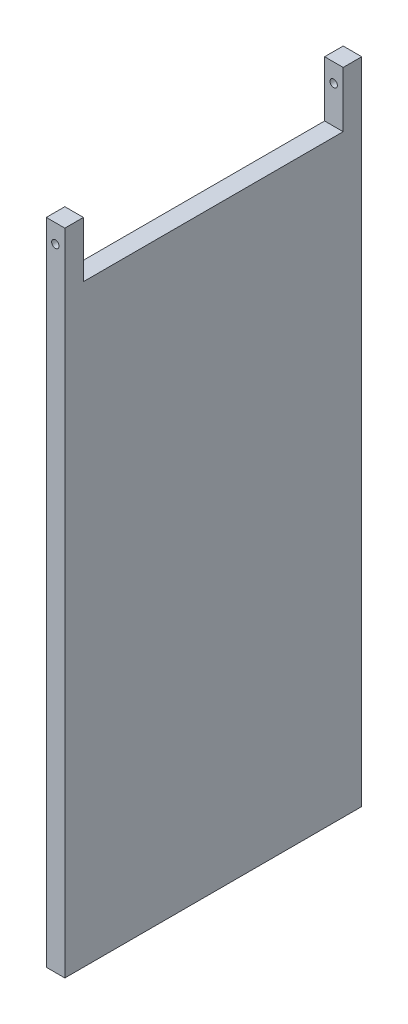
ISO-10303-21;
HEADER;
FILE_DESCRIPTION(('STEP AP214'),'2;1');
FILE_NAME('part.step','',(''),(''),'','','');
FILE_SCHEMA(('AUTOMOTIVE_DESIGN { 1 0 10303 214 1 1 1 1 }'));
ENDSEC;
DATA;
#1=APPLICATION_CONTEXT('core data for automotive mechanical design processes');
#2=APPLICATION_PROTOCOL_DEFINITION('international standard','automotive_design',2000,#1);
#3=PRODUCT_CONTEXT('',#1,'mechanical');
#4=PRODUCT('Part','Part','',(#3));
#5=PRODUCT_RELATED_PRODUCT_CATEGORY('part','',(#4));
#6=PRODUCT_DEFINITION_FORMATION('','',#4);
#7=PRODUCT_DEFINITION_CONTEXT('part definition',#1,'design');
#8=PRODUCT_DEFINITION('design','',#6,#7);
#9=PRODUCT_DEFINITION_SHAPE('','',#8);
#10=(LENGTH_UNIT() NAMED_UNIT(*) SI_UNIT(.MILLI.,.METRE.));
#11=(NAMED_UNIT(*) PLANE_ANGLE_UNIT() SI_UNIT($,.RADIAN.));
#12=(NAMED_UNIT(*) SI_UNIT($,.STERADIAN.) SOLID_ANGLE_UNIT());
#13=UNCERTAINTY_MEASURE_WITH_UNIT(LENGTH_MEASURE(1.E-05),#10,'distance_accuracy_value','');
#14=(GEOMETRIC_REPRESENTATION_CONTEXT(3) GLOBAL_UNCERTAINTY_ASSIGNED_CONTEXT((#13)) GLOBAL_UNIT_ASSIGNED_CONTEXT((#10,
#11,#12)) REPRESENTATION_CONTEXT('',''));
#15=CARTESIAN_POINT('',(0.,0.,0.));
#16=DIRECTION('',(0.,0.,1.));
#17=DIRECTION('',(1.,0.,0.));
#18=AXIS2_PLACEMENT_3D('',#15,#16,#17);
#19=CARTESIAN_POINT('',(-7.4015013693271,128.880516431925,80.));
#20=DIRECTION('',(0.,-1.,0.));
#21=DIRECTION('',(0.,0.,-1.));
#22=AXIS2_PLACEMENT_3D('',#19,#20,#21);
#23=PLANE('',#22);
#24=DIRECTION('',(0.,0.,-1.));
#25=VECTOR('',#24,1.);
#26=CARTESIAN_POINT('',(-2.4015013693271,128.880516431925,80.));
#27=LINE('',#26,#25);
#28=CARTESIAN_POINT('',(-2.4015013693271,128.880516431925,80.));
#29=VERTEX_POINT('',#28);
#30=CARTESIAN_POINT('',(-2.40150136932709,128.880516431925,75.));
#31=VERTEX_POINT('',#30);
#32=EDGE_CURVE('E153',#29,#31,#27,.T.);
#33=ORIENTED_EDGE('',*,*,#32,.T.);
#34=DIRECTION('',(1.,0.,0.));
#35=VECTOR('',#34,1.);
#36=CARTESIAN_POINT('',(-20.,128.880516431925,75.));
#37=LINE('',#36,#35);
#38=CARTESIAN_POINT('',(-7.4015013693271,128.880516431925,75.));
#39=VERTEX_POINT('',#38);
#40=EDGE_CURVE('E162',#39,#31,#37,.T.);
#41=ORIENTED_EDGE('',*,*,#40,.F.);
#42=DIRECTION('',(0.,0.,-1.));
#43=VECTOR('',#42,1.);
#44=CARTESIAN_POINT('',(-7.4015013693271,128.880516431925,80.));
#45=LINE('',#44,#43);
#46=CARTESIAN_POINT('',(-7.4015013693271,128.880516431925,80.));
#47=VERTEX_POINT('',#46);
#48=EDGE_CURVE('E150',#47,#39,#45,.T.);
#49=ORIENTED_EDGE('',*,*,#48,.F.);
#50=DIRECTION('',(-1.,0.,0.));
#51=VECTOR('',#50,1.);
#52=CARTESIAN_POINT('',(-7.4015013693271,128.880516431925,80.));
#53=LINE('',#52,#51);
#54=EDGE_CURVE('E56',#29,#47,#53,.T.);
#55=ORIENTED_EDGE('',*,*,#54,.F.);
#56=EDGE_LOOP('',(#33,#41,#49,#55));
#57=FACE_BOUND('',#56,.T.);
#58=ADVANCED_FACE('F32',(#57),#23,.F.);
#59=CARTESIAN_POINT('',(-4.95643834176419,123.880516431925,80.));
#60=DIRECTION('',(0.,0.,-1.));
#61=DIRECTION('',(-1.,0.,0.));
#62=AXIS2_PLACEMENT_3D('',#59,#60,#61);
#63=CYLINDRICAL_SURFACE('',#62,1.);
#64=CARTESIAN_POINT('',(-4.95643834176419,123.880516431925,75.));
#65=DIRECTION('',(0.,0.,1.));
#66=DIRECTION('',(1.,0.,0.));
#67=AXIS2_PLACEMENT_3D('',#64,#65,#66);
#68=CIRCLE('',#67,1.);
#69=CARTESIAN_POINT('',(-3.95643834176419,123.880516431925,75.));
#70=VERTEX_POINT('',#69);
#71=EDGE_CURVE('E112',#70,#70,#68,.T.);
#72=ORIENTED_EDGE('',*,*,#71,.F.);
#73=EDGE_LOOP('',(#72));
#74=FACE_BOUND('',#73,.T.);
#75=CARTESIAN_POINT('',(-4.95643834176419,123.880516431925,80.));
#76=DIRECTION('',(0.,0.,1.));
#77=DIRECTION('',(1.,0.,0.));
#78=AXIS2_PLACEMENT_3D('',#75,#76,#77);
#79=CIRCLE('',#78,1.);
#80=CARTESIAN_POINT('',(-3.95643834176419,123.880516431925,80.));
#81=VERTEX_POINT('',#80);
#82=EDGE_CURVE('E127',#81,#81,#79,.T.);
#83=ORIENTED_EDGE('',*,*,#82,.T.);
#84=EDGE_LOOP('',(#83));
#85=FACE_BOUND('',#84,.T.);
#86=ADVANCED_FACE('F196',(#74,#85),#63,.F.);
#87=CARTESIAN_POINT('',(-7.40150136932707,-46.1194835680751,80.));
#88=DIRECTION('',(0.,0.,1.));
#89=DIRECTION('',(1.,0.,0.));
#90=AXIS2_PLACEMENT_3D('',#87,#88,#89);
#91=PLANE('',#90);
#92=DIRECTION('',(0.,-1.,0.));
#93=VECTOR('',#92,1.);
#94=CARTESIAN_POINT('',(-7.4015013693271,128.880516431925,80.));
#95=LINE('',#94,#93);
#96=CARTESIAN_POINT('',(-7.40150136932707,-46.1194835680751,80.));
#97=VERTEX_POINT('',#96);
#98=EDGE_CURVE('E136',#47,#97,#95,.T.);
#99=ORIENTED_EDGE('',*,*,#98,.T.);
#100=DIRECTION('',(1.,0.,0.));
#101=VECTOR('',#100,1.);
#102=CARTESIAN_POINT('',(-7.40150136932707,-46.1194835680751,80.));
#103=LINE('',#102,#101);
#104=CARTESIAN_POINT('',(-2.40150136932707,-46.1194835680751,80.));
#105=VERTEX_POINT('',#104);
#106=EDGE_CURVE('E86',#97,#105,#103,.T.);
#107=ORIENTED_EDGE('',*,*,#106,.T.);
#108=DIRECTION('',(0.,1.,0.));
#109=VECTOR('',#108,1.);
#110=CARTESIAN_POINT('',(-2.4015013693271,128.880516431925,80.));
#111=LINE('',#110,#109);
#112=EDGE_CURVE('E140',#105,#29,#111,.T.);
#113=ORIENTED_EDGE('',*,*,#112,.T.);
#114=ORIENTED_EDGE('',*,*,#54,.T.);
#115=EDGE_LOOP('',(#99,#107,#113,#114));
#116=FACE_BOUND('',#115,.T.);
#117=ORIENTED_EDGE('',*,*,#82,.F.);
#118=EDGE_LOOP('',(#117));
#119=FACE_BOUND('',#118,.T.);
#120=ADVANCED_FACE('F179',(#116,#119),#91,.T.);
#121=CARTESIAN_POINT('',(-7.40150136932707,-46.1194835680751,0.));
#122=DIRECTION('',(0.,0.,1.));
#123=DIRECTION('',(1.,0.,0.));
#124=AXIS2_PLACEMENT_3D('',#121,#122,#123);
#125=PLANE('',#124);
#126=DIRECTION('',(0.,-1.,0.));
#127=VECTOR('',#126,1.);
#128=CARTESIAN_POINT('',(-7.4015013693271,128.880516431925,0.));
#129=LINE('',#128,#127);
#130=CARTESIAN_POINT('',(-7.4015013693271,128.880516431925,0.));
#131=VERTEX_POINT('',#130);
#132=CARTESIAN_POINT('',(-7.40150136932707,-46.1194835680751,0.));
#133=VERTEX_POINT('',#132);
#134=EDGE_CURVE('E134',#131,#133,#129,.T.);
#135=ORIENTED_EDGE('',*,*,#134,.F.);
#136=DIRECTION('',(-1.,0.,0.));
#137=VECTOR('',#136,1.);
#138=CARTESIAN_POINT('',(-7.4015013693271,128.880516431925,0.));
#139=LINE('',#138,#137);
#140=CARTESIAN_POINT('',(-2.4015013693271,128.880516431925,0.));
#141=VERTEX_POINT('',#140);
#142=EDGE_CURVE('E138',#141,#131,#139,.T.);
#143=ORIENTED_EDGE('',*,*,#142,.F.);
#144=DIRECTION('',(0.,1.,0.));
#145=VECTOR('',#144,1.);
#146=CARTESIAN_POINT('',(-2.4015013693271,128.880516431925,0.));
#147=LINE('',#146,#145);
#148=CARTESIAN_POINT('',(-2.40150136932707,-46.1194835680751,0.));
#149=VERTEX_POINT('',#148);
#150=EDGE_CURVE('E146',#149,#141,#147,.T.);
#151=ORIENTED_EDGE('',*,*,#150,.F.);
#152=DIRECTION('',(1.,0.,0.));
#153=VECTOR('',#152,1.);
#154=CARTESIAN_POINT('',(-7.40150136932707,-46.1194835680751,0.));
#155=LINE('',#154,#153);
#156=EDGE_CURVE('E144',#133,#149,#155,.T.);
#157=ORIENTED_EDGE('',*,*,#156,.F.);
#158=EDGE_LOOP('',(#135,#143,#151,#157));
#159=FACE_BOUND('',#158,.T.);
#160=CARTESIAN_POINT('',(-4.95643834176419,123.880516431925,0.));
#161=DIRECTION('',(0.,0.,1.));
#162=DIRECTION('',(1.,0.,0.));
#163=AXIS2_PLACEMENT_3D('',#160,#161,#162);
#164=CIRCLE('',#163,1.);
#165=CARTESIAN_POINT('',(-3.95643834176419,123.880516431925,0.));
#166=VERTEX_POINT('',#165);
#167=EDGE_CURVE('E124',#166,#166,#164,.T.);
#168=ORIENTED_EDGE('',*,*,#167,.T.);
#169=EDGE_LOOP('',(#168));
#170=FACE_BOUND('',#169,.T.);
#171=ADVANCED_FACE('F203',(#159,#170),#125,.F.);
#172=CARTESIAN_POINT('',(-7.4015013693271,128.880516431925,80.));
#173=DIRECTION('',(1.,0.,0.));
#174=DIRECTION('',(0.,1.,0.));
#175=AXIS2_PLACEMENT_3D('',#172,#173,#174);
#176=PLANE('',#175);
#177=ORIENTED_EDGE('',*,*,#48,.T.);
#178=DIRECTION('',(0.,-1.,0.));
#179=VECTOR('',#178,1.);
#180=CARTESIAN_POINT('',(-7.4015013693271,128.880516431925,75.));
#181=LINE('',#180,#179);
#182=CARTESIAN_POINT('',(-7.40150136932709,113.880516431925,75.));
#183=VERTEX_POINT('',#182);
#184=EDGE_CURVE('E123',#39,#183,#181,.T.);
#185=ORIENTED_EDGE('',*,*,#184,.T.);
#186=DIRECTION('',(0.,0.,-1.));
#187=VECTOR('',#186,1.);
#188=CARTESIAN_POINT('',(-7.40150136932709,113.880516431925,80.));
#189=LINE('',#188,#187);
#190=CARTESIAN_POINT('',(-7.40150136932709,113.880516431925,4.99999999999999));
#191=VERTEX_POINT('',#190);
#192=EDGE_CURVE('E117',#183,#191,#189,.T.);
#193=ORIENTED_EDGE('',*,*,#192,.T.);
#194=DIRECTION('',(0.,1.,0.));
#195=VECTOR('',#194,1.);
#196=CARTESIAN_POINT('',(-7.4015013693271,128.880516431925,4.99999999999999));
#197=LINE('',#196,#195);
#198=CARTESIAN_POINT('',(-7.4015013693271,128.880516431925,4.99999999999999));
#199=VERTEX_POINT('',#198);
#200=EDGE_CURVE('E106',#191,#199,#197,.T.);
#201=ORIENTED_EDGE('',*,*,#200,.T.);
#202=EDGE_CURVE('E78',#199,#131,#45,.T.);
#203=ORIENTED_EDGE('',*,*,#202,.T.);
#204=ORIENTED_EDGE('',*,*,#134,.T.);
#205=DIRECTION('',(0.,0.,-1.));
#206=VECTOR('',#205,1.);
#207=CARTESIAN_POINT('',(-7.40150136932707,-46.1194835680751,80.));
#208=LINE('',#207,#206);
#209=EDGE_CURVE('E40',#97,#133,#208,.T.);
#210=ORIENTED_EDGE('',*,*,#209,.F.);
#211=ORIENTED_EDGE('',*,*,#98,.F.);
#212=EDGE_LOOP('',(#177,#185,#193,#201,#203,#204,#210,#211));
#213=FACE_BOUND('',#212,.T.);
#214=ADVANCED_FACE('F34',(#213),#176,.F.);
#215=CARTESIAN_POINT('',(-7.40150136932707,-46.1194835680751,80.));
#216=DIRECTION('',(0.,1.,0.));
#217=DIRECTION('',(0.,0.,1.));
#218=AXIS2_PLACEMENT_3D('',#215,#216,#217);
#219=PLANE('',#218);
#220=ORIENTED_EDGE('',*,*,#156,.T.);
#221=DIRECTION('',(0.,0.,-1.));
#222=VECTOR('',#221,1.);
#223=CARTESIAN_POINT('',(-2.40150136932707,-46.1194835680751,80.));
#224=LINE('',#223,#222);
#225=EDGE_CURVE('E156',#105,#149,#224,.T.);
#226=ORIENTED_EDGE('',*,*,#225,.F.);
#227=ORIENTED_EDGE('',*,*,#106,.F.);
#228=ORIENTED_EDGE('',*,*,#209,.T.);
#229=EDGE_LOOP('',(#220,#226,#227,#228));
#230=FACE_BOUND('',#229,.T.);
#231=ADVANCED_FACE('F182',(#230),#219,.F.);
#232=CARTESIAN_POINT('',(-2.4015013693271,128.880516431925,80.));
#233=DIRECTION('',(-1.,0.,0.));
#234=DIRECTION('',(0.,-1.,0.));
#235=AXIS2_PLACEMENT_3D('',#232,#233,#234);
#236=PLANE('',#235);
#237=DIRECTION('',(0.,0.,1.));
#238=VECTOR('',#237,1.);
#239=CARTESIAN_POINT('',(-2.40150136932709,113.880516431925,80.));
#240=LINE('',#239,#238);
#241=CARTESIAN_POINT('',(-2.40150136932709,113.880516431925,4.99999999999999));
#242=VERTEX_POINT('',#241);
#243=CARTESIAN_POINT('',(-2.40150136932709,113.880516431925,75.));
#244=VERTEX_POINT('',#243);
#245=EDGE_CURVE('E11',#242,#244,#240,.T.);
#246=ORIENTED_EDGE('',*,*,#245,.T.);
#247=DIRECTION('',(0.,1.,0.));
#248=VECTOR('',#247,1.);
#249=CARTESIAN_POINT('',(-2.4015013693271,128.880516431925,75.));
#250=LINE('',#249,#248);
#251=EDGE_CURVE('E129',#244,#31,#250,.T.);
#252=ORIENTED_EDGE('',*,*,#251,.T.);
#253=ORIENTED_EDGE('',*,*,#32,.F.);
#254=ORIENTED_EDGE('',*,*,#112,.F.);
#255=ORIENTED_EDGE('',*,*,#225,.T.);
#256=ORIENTED_EDGE('',*,*,#150,.T.);
#257=CARTESIAN_POINT('',(-2.4015013693271,128.880516431925,4.99999999999999));
#258=VERTEX_POINT('',#257);
#259=EDGE_CURVE('E152',#258,#141,#27,.T.);
#260=ORIENTED_EDGE('',*,*,#259,.F.);
#261=DIRECTION('',(0.,-1.,0.));
#262=VECTOR('',#261,1.);
#263=CARTESIAN_POINT('',(-2.4015013693271,128.880516431925,4.99999999999999));
#264=LINE('',#263,#262);
#265=EDGE_CURVE('E47',#258,#242,#264,.T.);
#266=ORIENTED_EDGE('',*,*,#265,.T.);
#267=EDGE_LOOP('',(#246,#252,#253,#254,#255,#256,#260,#266));
#268=FACE_BOUND('',#267,.T.);
#269=ADVANCED_FACE('F184',(#268),#236,.F.);
#270=ORIENTED_EDGE('',*,*,#202,.F.);
#271=DIRECTION('',(1.,0.,0.));
#272=VECTOR('',#271,1.);
#273=CARTESIAN_POINT('',(-20.,128.880516431925,4.99999999999999));
#274=LINE('',#273,#272);
#275=EDGE_CURVE('E110',#199,#258,#274,.T.);
#276=ORIENTED_EDGE('',*,*,#275,.T.);
#277=ORIENTED_EDGE('',*,*,#259,.T.);
#278=ORIENTED_EDGE('',*,*,#142,.T.);
#279=EDGE_LOOP('',(#270,#276,#277,#278));
#280=FACE_BOUND('',#279,.T.);
#281=ADVANCED_FACE('F186',(#280),#23,.F.);
#282=CARTESIAN_POINT('',(-4.95643834176419,123.880516431925,4.99999999999999));
#283=DIRECTION('',(0.,0.,-1.));
#284=DIRECTION('',(0.,1.,0.));
#285=AXIS2_PLACEMENT_3D('',#282,#283,#284);
#286=CIRCLE('',#285,1.);
#287=CARTESIAN_POINT('',(-4.95643834176419,124.880516431925,4.99999999999999));
#288=VERTEX_POINT('',#287);
#289=EDGE_CURVE('E160',#288,#288,#286,.T.);
#290=ORIENTED_EDGE('',*,*,#289,.F.);
#291=EDGE_LOOP('',(#290));
#292=FACE_BOUND('',#291,.T.);
#293=ORIENTED_EDGE('',*,*,#167,.F.);
#294=EDGE_LOOP('',(#293));
#295=FACE_BOUND('',#294,.T.);
#296=ADVANCED_FACE('F192',(#292,#295),#63,.F.);
#297=CARTESIAN_POINT('',(-20.,113.880516431925,75.));
#298=DIRECTION('',(0.,-1.,0.));
#299=DIRECTION('',(0.,0.,-1.));
#300=AXIS2_PLACEMENT_3D('',#297,#298,#299);
#301=PLANE('',#300);
#302=DIRECTION('',(1.,0.,0.));
#303=VECTOR('',#302,1.);
#304=CARTESIAN_POINT('',(-20.,113.880516431925,75.));
#305=LINE('',#304,#303);
#306=EDGE_CURVE('E119',#183,#244,#305,.T.);
#307=ORIENTED_EDGE('',*,*,#306,.T.);
#308=ORIENTED_EDGE('',*,*,#245,.F.);
#309=DIRECTION('',(1.,0.,0.));
#310=VECTOR('',#309,1.);
#311=CARTESIAN_POINT('',(-20.,113.880516431925,4.99999999999999));
#312=LINE('',#311,#310);
#313=EDGE_CURVE('E109',#191,#242,#312,.T.);
#314=ORIENTED_EDGE('',*,*,#313,.F.);
#315=ORIENTED_EDGE('',*,*,#192,.F.);
#316=EDGE_LOOP('',(#307,#308,#314,#315));
#317=FACE_BOUND('',#316,.T.);
#318=ADVANCED_FACE('F116',(#317),#301,.F.);
#319=CARTESIAN_POINT('',(-20.,128.880516431925,75.));
#320=DIRECTION('',(0.,0.,1.));
#321=DIRECTION('',(1.,0.,0.));
#322=AXIS2_PLACEMENT_3D('',#319,#320,#321);
#323=PLANE('',#322);
#324=ORIENTED_EDGE('',*,*,#71,.T.);
#325=EDGE_LOOP('',(#324));
#326=FACE_BOUND('',#325,.T.);
#327=ORIENTED_EDGE('',*,*,#40,.T.);
#328=ORIENTED_EDGE('',*,*,#251,.F.);
#329=ORIENTED_EDGE('',*,*,#306,.F.);
#330=ORIENTED_EDGE('',*,*,#184,.F.);
#331=EDGE_LOOP('',(#327,#328,#329,#330));
#332=FACE_BOUND('',#331,.T.);
#333=ADVANCED_FACE('F175',(#326,#332),#323,.F.);
#334=CARTESIAN_POINT('',(-20.,128.880516431925,4.99999999999999));
#335=DIRECTION('',(0.,0.,-1.));
#336=DIRECTION('',(0.,1.,0.));
#337=AXIS2_PLACEMENT_3D('',#334,#335,#336);
#338=PLANE('',#337);
#339=ORIENTED_EDGE('',*,*,#289,.T.);
#340=EDGE_LOOP('',(#339));
#341=FACE_BOUND('',#340,.T.);
#342=ORIENTED_EDGE('',*,*,#313,.T.);
#343=ORIENTED_EDGE('',*,*,#265,.F.);
#344=ORIENTED_EDGE('',*,*,#275,.F.);
#345=ORIENTED_EDGE('',*,*,#200,.F.);
#346=EDGE_LOOP('',(#342,#343,#344,#345));
#347=FACE_BOUND('',#346,.T.);
#348=ADVANCED_FACE('F108',(#341,#347),#338,.F.);
#349=CLOSED_SHELL('',(#58,#86,#120,#171,#214,#231,#269,#281,#296,#318,#333,#348));
#350=MANIFOLD_SOLID_BREP('B2',#349);
#351=ADVANCED_BREP_SHAPE_REPRESENTATION('',(#18,#350),#14);
#352=SHAPE_DEFINITION_REPRESENTATION(#9,#351);
ENDSEC;
END-ISO-10303-21;
